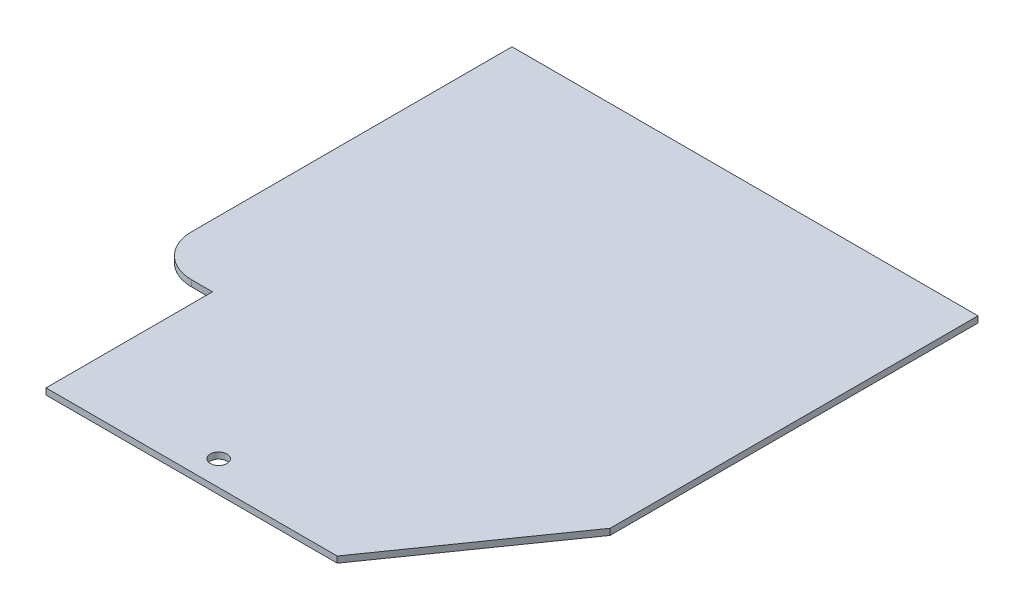
ISO-10303-21;
HEADER;
FILE_DESCRIPTION(('STEP AP214'),'2;1');
FILE_NAME('part.step','',(''),(''),'','','');
FILE_SCHEMA(('AUTOMOTIVE_DESIGN { 1 0 10303 214 1 1 1 1 }'));
ENDSEC;
DATA;
#1=APPLICATION_CONTEXT('core data for automotive mechanical design processes');
#2=APPLICATION_PROTOCOL_DEFINITION('international standard','automotive_design',2000,#1);
#3=PRODUCT_CONTEXT('',#1,'mechanical');
#4=PRODUCT('Part','Part','',(#3));
#5=PRODUCT_RELATED_PRODUCT_CATEGORY('part','',(#4));
#6=PRODUCT_DEFINITION_FORMATION('','',#4);
#7=PRODUCT_DEFINITION_CONTEXT('part definition',#1,'design');
#8=PRODUCT_DEFINITION('design','',#6,#7);
#9=PRODUCT_DEFINITION_SHAPE('','',#8);
#10=(LENGTH_UNIT() NAMED_UNIT(*) SI_UNIT(.MILLI.,.METRE.));
#11=(NAMED_UNIT(*) PLANE_ANGLE_UNIT() SI_UNIT($,.RADIAN.));
#12=(NAMED_UNIT(*) SI_UNIT($,.STERADIAN.) SOLID_ANGLE_UNIT());
#13=UNCERTAINTY_MEASURE_WITH_UNIT(LENGTH_MEASURE(1.E-05),#10,'distance_accuracy_value','');
#14=(GEOMETRIC_REPRESENTATION_CONTEXT(3) GLOBAL_UNCERTAINTY_ASSIGNED_CONTEXT((#13)) GLOBAL_UNIT_ASSIGNED_CONTEXT((#10,
#11,#12)) REPRESENTATION_CONTEXT('',''));
#15=CARTESIAN_POINT('',(0.,0.,0.));
#16=DIRECTION('',(0.,0.,1.));
#17=DIRECTION('',(1.,0.,0.));
#18=AXIS2_PLACEMENT_3D('',#15,#16,#17);
#19=CARTESIAN_POINT('',(-5.,1.5,-49.9999999999999));
#20=DIRECTION('',(0.,-1.,0.));
#21=DIRECTION('',(0.,0.,-1.));
#22=AXIS2_PLACEMENT_3D('',#19,#20,#21);
#23=PLANE('',#22);
#24=DIRECTION('',(0.,0.,1.));
#25=VECTOR('',#24,1.);
#26=CARTESIAN_POINT('',(0.,1.5,0.));
#27=LINE('',#26,#25);
#28=CARTESIAN_POINT('',(0.,1.5,-39.9999999999999));
#29=VERTEX_POINT('',#28);
#30=CARTESIAN_POINT('',(0.,1.5,0.));
#31=VERTEX_POINT('',#30);
#32=EDGE_CURVE('E145',#29,#31,#27,.T.);
#33=ORIENTED_EDGE('',*,*,#32,.T.);
#34=DIRECTION('',(1.,0.,0.));
#35=VECTOR('',#34,1.);
#36=CARTESIAN_POINT('',(0.,1.5,0.));
#37=LINE('',#36,#35);
#38=CARTESIAN_POINT('',(70.,1.5,0.));
#39=VERTEX_POINT('',#38);
#40=EDGE_CURVE('E93',#31,#39,#37,.T.);
#41=ORIENTED_EDGE('',*,*,#40,.T.);
#42=DIRECTION('',(0.573576436351047,0.,-0.819152044288991));
#43=VECTOR('',#42,1.);
#44=CARTESIAN_POINT('',(70.,1.5,0.));
#45=LINE('',#44,#43);
#46=CARTESIAN_POINT('',(97.0083015283885,1.5,-38.5718519932579));
#47=VERTEX_POINT('',#46);
#48=EDGE_CURVE('E160',#39,#47,#45,.T.);
#49=ORIENTED_EDGE('',*,*,#48,.T.);
#50=DIRECTION('',(0.,0.,-1.));
#51=VECTOR('',#50,1.);
#52=CARTESIAN_POINT('',(97.0083015283885,1.5,-127.));
#53=LINE('',#52,#51);
#54=CARTESIAN_POINT('',(97.0083015283885,1.5,-127.));
#55=VERTEX_POINT('',#54);
#56=EDGE_CURVE('E173',#47,#55,#53,.T.);
#57=ORIENTED_EDGE('',*,*,#56,.T.);
#58=DIRECTION('',(-1.,0.,0.));
#59=VECTOR('',#58,1.);
#60=CARTESIAN_POINT('',(-15.,1.5,-127.));
#61=LINE('',#60,#59);
#62=CARTESIAN_POINT('',(-15.,1.5,-127.));
#63=VERTEX_POINT('',#62);
#64=EDGE_CURVE('E112',#55,#63,#61,.T.);
#65=ORIENTED_EDGE('',*,*,#64,.T.);
#66=DIRECTION('',(0.,0.,1.));
#67=VECTOR('',#66,1.);
#68=CARTESIAN_POINT('',(-15.,1.5,-54.9999999999999));
#69=LINE('',#68,#67);
#70=CARTESIAN_POINT('',(-15.,1.5,-50.));
#71=VERTEX_POINT('',#70);
#72=EDGE_CURVE('E106',#63,#71,#69,.T.);
#73=ORIENTED_EDGE('',*,*,#72,.T.);
#74=CARTESIAN_POINT('',(-5.,1.5,-49.9999999999999));
#75=DIRECTION('',(0.,1.,0.));
#76=DIRECTION('',(0.,0.,-1.));
#77=AXIS2_PLACEMENT_3D('',#74,#75,#76);
#78=CIRCLE('',#77,10.);
#79=CARTESIAN_POINT('',(-4.99999999999993,1.5,-39.9999999999999));
#80=VERTEX_POINT('',#79);
#81=EDGE_CURVE('E110',#71,#80,#78,.T.);
#82=ORIENTED_EDGE('',*,*,#81,.T.);
#83=DIRECTION('',(1.,0.,0.));
#84=VECTOR('',#83,1.);
#85=CARTESIAN_POINT('',(0.,1.5,-39.9999999999999));
#86=LINE('',#85,#84);
#87=EDGE_CURVE('E50',#80,#29,#86,.T.);
#88=ORIENTED_EDGE('',*,*,#87,.T.);
#89=EDGE_LOOP('',(#33,#41,#49,#57,#65,#73,#82,#88));
#90=FACE_BOUND('',#89,.T.);
#91=CARTESIAN_POINT('',(35.5,1.5,-6.));
#92=DIRECTION('',(0.,1.,0.));
#93=DIRECTION('',(0.,0.,1.));
#94=AXIS2_PLACEMENT_3D('',#91,#92,#93);
#95=CIRCLE('',#94,2.);
#96=CARTESIAN_POINT('',(35.5,1.5,-4.));
#97=VERTEX_POINT('',#96);
#98=EDGE_CURVE('E133',#97,#97,#95,.T.);
#99=ORIENTED_EDGE('',*,*,#98,.F.);
#100=EDGE_LOOP('',(#99));
#101=FACE_BOUND('',#100,.T.);
#102=ADVANCED_FACE('F33',(#90,#101),#23,.F.);
#103=CARTESIAN_POINT('',(-5.,0.,-49.9999999999999));
#104=DIRECTION('',(0.,-1.,0.));
#105=DIRECTION('',(0.,0.,-1.));
#106=AXIS2_PLACEMENT_3D('',#103,#104,#105);
#107=PLANE('',#106);
#108=DIRECTION('',(0.,0.,1.));
#109=VECTOR('',#108,1.);
#110=CARTESIAN_POINT('',(0.,0.,0.));
#111=LINE('',#110,#109);
#112=CARTESIAN_POINT('',(0.,0.,-39.9999999999999));
#113=VERTEX_POINT('',#112);
#114=CARTESIAN_POINT('',(0.,0.,0.));
#115=VERTEX_POINT('',#114);
#116=EDGE_CURVE('E129',#113,#115,#111,.T.);
#117=ORIENTED_EDGE('',*,*,#116,.F.);
#118=DIRECTION('',(1.,0.,0.));
#119=VECTOR('',#118,1.);
#120=CARTESIAN_POINT('',(0.,0.,-39.9999999999999));
#121=LINE('',#120,#119);
#122=CARTESIAN_POINT('',(-4.99999999999993,0.,-39.9999999999999));
#123=VERTEX_POINT('',#122);
#124=EDGE_CURVE('E85',#123,#113,#121,.T.);
#125=ORIENTED_EDGE('',*,*,#124,.F.);
#126=CARTESIAN_POINT('',(-5.,0.,-49.9999999999999));
#127=DIRECTION('',(0.,1.,0.));
#128=DIRECTION('',(0.,0.,-1.));
#129=AXIS2_PLACEMENT_3D('',#126,#127,#128);
#130=CIRCLE('',#129,10.);
#131=CARTESIAN_POINT('',(-15.,0.,-50.));
#132=VERTEX_POINT('',#131);
#133=EDGE_CURVE('E79',#132,#123,#130,.T.);
#134=ORIENTED_EDGE('',*,*,#133,.F.);
#135=DIRECTION('',(0.,0.,1.));
#136=VECTOR('',#135,1.);
#137=CARTESIAN_POINT('',(-15.,0.,-50.));
#138=LINE('',#137,#136);
#139=CARTESIAN_POINT('',(-15.,0.,-127.));
#140=VERTEX_POINT('',#139);
#141=EDGE_CURVE('E119',#140,#132,#138,.T.);
#142=ORIENTED_EDGE('',*,*,#141,.F.);
#143=DIRECTION('',(-1.,0.,0.));
#144=VECTOR('',#143,1.);
#145=CARTESIAN_POINT('',(-15.,0.,-127.));
#146=LINE('',#145,#144);
#147=CARTESIAN_POINT('',(97.0083015283885,0.,-127.));
#148=VERTEX_POINT('',#147);
#149=EDGE_CURVE('E139',#148,#140,#146,.T.);
#150=ORIENTED_EDGE('',*,*,#149,.F.);
#151=DIRECTION('',(0.,0.,-1.));
#152=VECTOR('',#151,1.);
#153=CARTESIAN_POINT('',(97.0083015283885,0.,-127.));
#154=LINE('',#153,#152);
#155=CARTESIAN_POINT('',(97.0083015283885,0.,-38.5718519932579));
#156=VERTEX_POINT('',#155);
#157=EDGE_CURVE('E137',#156,#148,#154,.T.);
#158=ORIENTED_EDGE('',*,*,#157,.F.);
#159=DIRECTION('',(0.573576436351047,0.,-0.819152044288991));
#160=VECTOR('',#159,1.);
#161=CARTESIAN_POINT('',(70.,0.,0.));
#162=LINE('',#161,#160);
#163=CARTESIAN_POINT('',(70.,0.,0.));
#164=VERTEX_POINT('',#163);
#165=EDGE_CURVE('E135',#164,#156,#162,.T.);
#166=ORIENTED_EDGE('',*,*,#165,.F.);
#167=DIRECTION('',(1.,0.,0.));
#168=VECTOR('',#167,1.);
#169=CARTESIAN_POINT('',(0.,0.,0.));
#170=LINE('',#169,#168);
#171=EDGE_CURVE('E132',#115,#164,#170,.T.);
#172=ORIENTED_EDGE('',*,*,#171,.F.);
#173=EDGE_LOOP('',(#117,#125,#134,#142,#150,#158,#166,#172));
#174=FACE_BOUND('',#173,.T.);
#175=CARTESIAN_POINT('',(35.5,0.,-6.));
#176=DIRECTION('',(0.,1.,0.));
#177=DIRECTION('',(0.,0.,1.));
#178=AXIS2_PLACEMENT_3D('',#175,#176,#177);
#179=CIRCLE('',#178,2.);
#180=CARTESIAN_POINT('',(35.5,0.,-4.));
#181=VERTEX_POINT('',#180);
#182=EDGE_CURVE('E179',#181,#181,#179,.T.);
#183=ORIENTED_EDGE('',*,*,#182,.T.);
#184=EDGE_LOOP('',(#183));
#185=FACE_BOUND('',#184,.T.);
#186=ADVANCED_FACE('F164',(#174,#185),#107,.T.);
#187=CARTESIAN_POINT('',(0.,1.5,0.));
#188=DIRECTION('',(1.,0.,0.));
#189=DIRECTION('',(0.,0.,-1.));
#190=AXIS2_PLACEMENT_3D('',#187,#188,#189);
#191=PLANE('',#190);
#192=ORIENTED_EDGE('',*,*,#116,.T.);
#193=DIRECTION('',(0.,-1.,0.));
#194=VECTOR('',#193,1.);
#195=CARTESIAN_POINT('',(0.,1.5,0.));
#196=LINE('',#195,#194);
#197=EDGE_CURVE('E11',#31,#115,#196,.T.);
#198=ORIENTED_EDGE('',*,*,#197,.F.);
#199=ORIENTED_EDGE('',*,*,#32,.F.);
#200=DIRECTION('',(0.,-1.,0.));
#201=VECTOR('',#200,1.);
#202=CARTESIAN_POINT('',(0.,1.5,-39.9999999999999));
#203=LINE('',#202,#201);
#204=EDGE_CURVE('E125',#29,#113,#203,.T.);
#205=ORIENTED_EDGE('',*,*,#204,.T.);
#206=EDGE_LOOP('',(#192,#198,#199,#205));
#207=FACE_BOUND('',#206,.T.);
#208=ADVANCED_FACE('F35',(#207),#191,.F.);
#209=CARTESIAN_POINT('',(0.,1.5,0.));
#210=DIRECTION('',(0.,0.,-1.));
#211=DIRECTION('',(-1.,0.,0.));
#212=AXIS2_PLACEMENT_3D('',#209,#210,#211);
#213=PLANE('',#212);
#214=ORIENTED_EDGE('',*,*,#171,.T.);
#215=DIRECTION('',(0.,-1.,0.));
#216=VECTOR('',#215,1.);
#217=CARTESIAN_POINT('',(70.,1.5,0.));
#218=LINE('',#217,#216);
#219=EDGE_CURVE('E42',#39,#164,#218,.T.);
#220=ORIENTED_EDGE('',*,*,#219,.F.);
#221=ORIENTED_EDGE('',*,*,#40,.F.);
#222=ORIENTED_EDGE('',*,*,#197,.T.);
#223=EDGE_LOOP('',(#214,#220,#221,#222));
#224=FACE_BOUND('',#223,.T.);
#225=ADVANCED_FACE('F207',(#224),#213,.F.);
#226=CARTESIAN_POINT('',(70.,1.5,0.));
#227=DIRECTION('',(-0.819152044288991,0.,-0.573576436351047));
#228=DIRECTION('',(-0.573576436351047,0.,0.819152044288991));
#229=AXIS2_PLACEMENT_3D('',#226,#227,#228);
#230=PLANE('',#229);
#231=ORIENTED_EDGE('',*,*,#165,.T.);
#232=DIRECTION('',(0.,-1.,0.));
#233=VECTOR('',#232,1.);
#234=CARTESIAN_POINT('',(97.0083015283885,1.5,-38.5718519932579));
#235=LINE('',#234,#233);
#236=EDGE_CURVE('E152',#47,#156,#235,.T.);
#237=ORIENTED_EDGE('',*,*,#236,.F.);
#238=ORIENTED_EDGE('',*,*,#48,.F.);
#239=ORIENTED_EDGE('',*,*,#219,.T.);
#240=EDGE_LOOP('',(#231,#237,#238,#239));
#241=FACE_BOUND('',#240,.T.);
#242=ADVANCED_FACE('F158',(#241),#230,.F.);
#243=CARTESIAN_POINT('',(97.0083015283885,1.5,-127.));
#244=DIRECTION('',(-1.,0.,0.));
#245=DIRECTION('',(0.,0.,1.));
#246=AXIS2_PLACEMENT_3D('',#243,#244,#245);
#247=PLANE('',#246);
#248=ORIENTED_EDGE('',*,*,#157,.T.);
#249=DIRECTION('',(0.,-1.,0.));
#250=VECTOR('',#249,1.);
#251=CARTESIAN_POINT('',(97.0083015283885,1.5,-127.));
#252=LINE('',#251,#250);
#253=EDGE_CURVE('E149',#55,#148,#252,.T.);
#254=ORIENTED_EDGE('',*,*,#253,.F.);
#255=ORIENTED_EDGE('',*,*,#56,.F.);
#256=ORIENTED_EDGE('',*,*,#236,.T.);
#257=EDGE_LOOP('',(#248,#254,#255,#256));
#258=FACE_BOUND('',#257,.T.);
#259=ADVANCED_FACE('F169',(#258),#247,.F.);
#260=CARTESIAN_POINT('',(-15.,1.5,-127.));
#261=DIRECTION('',(0.,0.,1.));
#262=DIRECTION('',(1.,0.,0.));
#263=AXIS2_PLACEMENT_3D('',#260,#261,#262);
#264=PLANE('',#263);
#265=ORIENTED_EDGE('',*,*,#149,.T.);
#266=DIRECTION('',(0.,-1.,0.));
#267=VECTOR('',#266,1.);
#268=CARTESIAN_POINT('',(-15.,1.5,-127.));
#269=LINE('',#268,#267);
#270=EDGE_CURVE('E120',#63,#140,#269,.T.);
#271=ORIENTED_EDGE('',*,*,#270,.F.);
#272=ORIENTED_EDGE('',*,*,#64,.F.);
#273=ORIENTED_EDGE('',*,*,#253,.T.);
#274=EDGE_LOOP('',(#265,#271,#272,#273));
#275=FACE_BOUND('',#274,.T.);
#276=ADVANCED_FACE('F172',(#275),#264,.F.);
#277=CARTESIAN_POINT('',(-15.,1.5,-50.));
#278=DIRECTION('',(1.,0.,0.));
#279=DIRECTION('',(0.,0.,-1.));
#280=AXIS2_PLACEMENT_3D('',#277,#278,#279);
#281=PLANE('',#280);
#282=ORIENTED_EDGE('',*,*,#141,.T.);
#283=DIRECTION('',(0.,-1.,0.));
#284=VECTOR('',#283,1.);
#285=CARTESIAN_POINT('',(-15.,1.5,-50.));
#286=LINE('',#285,#284);
#287=EDGE_CURVE('E117',#71,#132,#286,.T.);
#288=ORIENTED_EDGE('',*,*,#287,.F.);
#289=ORIENTED_EDGE('',*,*,#72,.F.);
#290=ORIENTED_EDGE('',*,*,#270,.T.);
#291=EDGE_LOOP('',(#282,#288,#289,#290));
#292=FACE_BOUND('',#291,.T.);
#293=ADVANCED_FACE('F118',(#292),#281,.F.);
#294=CARTESIAN_POINT('',(-5.,1.5,-49.9999999999999));
#295=DIRECTION('',(0.,-1.,0.));
#296=DIRECTION('',(0.,0.,-1.));
#297=AXIS2_PLACEMENT_3D('',#294,#295,#296);
#298=CYLINDRICAL_SURFACE('',#297,10.);
#299=ORIENTED_EDGE('',*,*,#133,.T.);
#300=DIRECTION('',(0.,-1.,0.));
#301=VECTOR('',#300,1.);
#302=CARTESIAN_POINT('',(-4.99999999999993,1.5,-39.9999999999999));
#303=LINE('',#302,#301);
#304=EDGE_CURVE('E121',#80,#123,#303,.T.);
#305=ORIENTED_EDGE('',*,*,#304,.F.);
#306=ORIENTED_EDGE('',*,*,#81,.F.);
#307=ORIENTED_EDGE('',*,*,#287,.T.);
#308=EDGE_LOOP('',(#299,#305,#306,#307));
#309=FACE_BOUND('',#308,.T.);
#310=ADVANCED_FACE('F123',(#309),#298,.T.);
#311=CARTESIAN_POINT('',(0.,1.5,-39.9999999999999));
#312=DIRECTION('',(0.,0.,-1.));
#313=DIRECTION('',(-1.,0.,0.));
#314=AXIS2_PLACEMENT_3D('',#311,#312,#313);
#315=PLANE('',#314);
#316=ORIENTED_EDGE('',*,*,#124,.T.);
#317=ORIENTED_EDGE('',*,*,#204,.F.);
#318=ORIENTED_EDGE('',*,*,#87,.F.);
#319=ORIENTED_EDGE('',*,*,#304,.T.);
#320=EDGE_LOOP('',(#316,#317,#318,#319));
#321=FACE_BOUND('',#320,.T.);
#322=ADVANCED_FACE('F195',(#321),#315,.F.);
#323=CARTESIAN_POINT('',(35.5,1.5,-6.));
#324=DIRECTION('',(0.,-1.,0.));
#325=DIRECTION('',(0.,0.,-1.));
#326=AXIS2_PLACEMENT_3D('',#323,#324,#325);
#327=CYLINDRICAL_SURFACE('',#326,2.);
#328=ORIENTED_EDGE('',*,*,#98,.T.);
#329=EDGE_LOOP('',(#328));
#330=FACE_BOUND('',#329,.T.);
#331=ORIENTED_EDGE('',*,*,#182,.F.);
#332=EDGE_LOOP('',(#331));
#333=FACE_BOUND('',#332,.T.);
#334=ADVANCED_FACE('F185',(#330,#333),#327,.F.);
#335=CLOSED_SHELL('',(#102,#186,#208,#225,#242,#259,#276,#293,#310,#322,#334));
#336=MANIFOLD_SOLID_BREP('B2',#335);
#337=ADVANCED_BREP_SHAPE_REPRESENTATION('',(#18,#336),#14);
#338=SHAPE_DEFINITION_REPRESENTATION(#9,#337);
ENDSEC;
END-ISO-10303-21;
